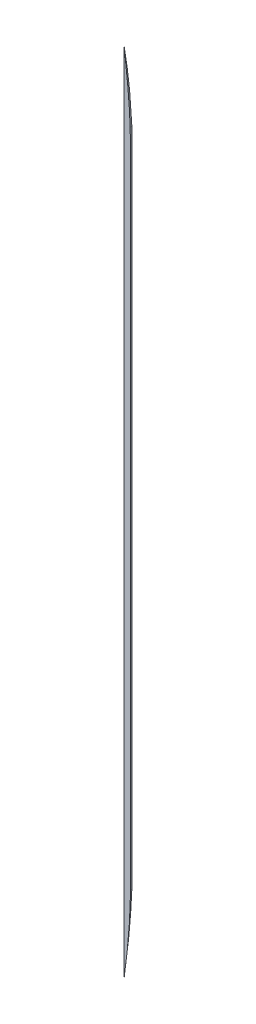
ISO-10303-21;
HEADER;
FILE_DESCRIPTION(('STEP AP214'),'2;1');
FILE_NAME('part.step','',(''),(''),'','','');
FILE_SCHEMA(('AUTOMOTIVE_DESIGN { 1 0 10303 214 1 1 1 1 }'));
ENDSEC;
DATA;
#1=APPLICATION_CONTEXT('core data for automotive mechanical design processes');
#2=APPLICATION_PROTOCOL_DEFINITION('international standard','automotive_design',2000,#1);
#3=PRODUCT_CONTEXT('',#1,'mechanical');
#4=PRODUCT('Part','Part','',(#3));
#5=PRODUCT_RELATED_PRODUCT_CATEGORY('part','',(#4));
#6=PRODUCT_DEFINITION_FORMATION('','',#4);
#7=PRODUCT_DEFINITION_CONTEXT('part definition',#1,'design');
#8=PRODUCT_DEFINITION('design','',#6,#7);
#9=PRODUCT_DEFINITION_SHAPE('','',#8);
#10=(LENGTH_UNIT() NAMED_UNIT(*) SI_UNIT(.MILLI.,.METRE.));
#11=(NAMED_UNIT(*) PLANE_ANGLE_UNIT() SI_UNIT($,.RADIAN.));
#12=(NAMED_UNIT(*) SI_UNIT($,.STERADIAN.) SOLID_ANGLE_UNIT());
#13=UNCERTAINTY_MEASURE_WITH_UNIT(LENGTH_MEASURE(1.E-05),#10,'distance_accuracy_value','');
#14=(GEOMETRIC_REPRESENTATION_CONTEXT(3) GLOBAL_UNCERTAINTY_ASSIGNED_CONTEXT((#13)) GLOBAL_UNIT_ASSIGNED_CONTEXT((#10,
#11,#12)) REPRESENTATION_CONTEXT('',''));
#15=CARTESIAN_POINT('',(0.,0.,0.));
#16=DIRECTION('',(0.,0.,1.));
#17=DIRECTION('',(1.,0.,0.));
#18=AXIS2_PLACEMENT_3D('',#15,#16,#17);
#19=CARTESIAN_POINT('',(12.4612357790928,495.3,-81.6542887644158));
#20=DIRECTION('',(0.169613823099529,0.,-0.985510604211625));
#21=DIRECTION('',(-0.985510604211625,0.,-0.169613823099529));
#22=AXIS2_PLACEMENT_3D('',#19,#20,#21);
#23=PLANE('',#22);
#24=DIRECTION('',(0.,-1.,0.));
#25=VECTOR('',#24,1.);
#26=CARTESIAN_POINT('',(12.4612357790928,495.3,-81.6542887644158));
#27=LINE('',#26,#25);
#28=CARTESIAN_POINT('',(12.4612357790928,415.242456298159,-81.6542887644158));
#29=VERTEX_POINT('',#28);
#30=CARTESIAN_POINT('',(12.4612357790928,80.0575437018381,-81.6542887644158));
#31=VERTEX_POINT('',#30);
#32=EDGE_CURVE('E112',#29,#31,#27,.T.);
#33=ORIENTED_EDGE('',*,*,#32,.T.);
#34=CARTESIAN_POINT('',(15.5576558850124,110.49,-81.1213714626203));
#35=CARTESIAN_POINT('',(15.5573761043063,110.040982554189,-81.1214462577349));
#36=CARTESIAN_POINT('',(15.5517424887391,109.592022848468,-81.1224973708107));
#37=CARTESIAN_POINT('',(15.5308488221356,108.641129884217,-81.126311379444));
#38=CARTESIAN_POINT('',(15.5145277652385,108.139219683667,-81.1292622521924));
#39=CARTESIAN_POINT('',(15.4723158333111,107.082237141519,-81.1367839044593));
#40=CARTESIAN_POINT('',(15.4455902638681,106.527201353635,-81.1414938364033));
#41=CARTESIAN_POINT('',(15.3821952597116,105.363691918705,-81.1525865340898));
#42=CARTESIAN_POINT('',(15.3448125768299,104.755258888441,-81.1590872735439));
#43=CARTESIAN_POINT('',(15.2120828658352,102.767497200931,-81.1820414089014));
#44=CARTESIAN_POINT('',(15.1033493956765,101.389084831941,-81.2006613852127));
#45=CARTESIAN_POINT('',(14.915000144622,99.2407343200765,-81.2327071583013));
#46=CARTESIAN_POINT('',(14.8436336656836,98.4700215676278,-81.2448118374642));
#47=CARTESIAN_POINT('',(14.7291850823923,97.293672104699,-81.2642291324648));
#48=CARTESIAN_POINT('',(14.6886904743312,96.88777830199,-81.2711003530379));
#49=CARTESIAN_POINT('',(14.6041344643552,96.0622610433507,-81.2855434824527));
#50=CARTESIAN_POINT('',(14.5599982870824,95.64264555765,-81.2931313630692));
#51=CARTESIAN_POINT('',(14.4454723448685,94.5729572750733,-81.3127006640724));
#52=CARTESIAN_POINT('',(14.3739882677591,93.9230041057644,-81.3248042670422));
#53=CARTESIAN_POINT('',(14.2282662819478,92.6278937152916,-81.3489076429986));
#54=CARTESIAN_POINT('',(14.1540504678847,91.9827340042198,-81.3609075613251));
#55=CARTESIAN_POINT('',(13.926747515909,90.0614672963077,-81.3971233936048));
#56=CARTESIAN_POINT('',(13.7675838443972,88.786077164369,-81.4217963629207));
#57=CARTESIAN_POINT('',(13.4302987028644,86.2565734188125,-81.4750844917229));
#58=CARTESIAN_POINT('',(13.2524838616839,85.0024183042082,-81.503637642509));
#59=CARTESIAN_POINT('',(12.8746722062458,82.5171949665425,-81.5703998435575));
#60=CARTESIAN_POINT('',(12.6750524995211,81.2860649627977,-81.6084559624795));
#61=CARTESIAN_POINT('',(12.4612357790928,80.0575437018381,-81.6542887644158));
#62=B_SPLINE_CURVE_WITH_KNOTS('',3,(#34,#35,#36,#37,#38,#39,#40,#41,#42,#43,#44,#45,#46,#47,#48,
#49,#50,#51,#52,#53,#54,#55,#56,#57,#58,#59,#60,#61),.UNSPECIFIED.,.F.,.F.,(4,2,2,2,2,2,2,2,2,2,
2,2,2,4),(0.,1.34694051996569,2.85339308380905,4.52043772306062,6.34923968809894,
10.4973384216574,12.8196329498258,14.043526300628,15.3095174275991,17.2714609577166,
19.2200300254349,23.0764538670335,26.8772416352339,30.6204146412588),.UNSPECIFIED.);
#63=CARTESIAN_POINT('',(15.5538067508728,110.49,-81.1220714804129));
#64=VERTEX_POINT('',#63);
#65=EDGE_CURVE('E12',#31,#64,#62,.F.);
#66=ORIENTED_EDGE('',*,*,#65,.T.);
#67=DIRECTION('',(0.,-1.,0.));
#68=VECTOR('',#67,1.);
#69=CARTESIAN_POINT('',(15.553799764757,495.3,-81.1220351300593));
#70=LINE('',#69,#68);
#71=CARTESIAN_POINT('',(15.5557278248849,384.81,-81.1217032963398));
#72=VERTEX_POINT('',#71);
#73=EDGE_CURVE('E98',#72,#64,#70,.T.);
#74=ORIENTED_EDGE('',*,*,#73,.F.);
#75=CARTESIAN_POINT('',(12.4612357790928,415.242456298159,-81.6542887644158));
#76=CARTESIAN_POINT('',(12.5707845457755,414.583787863773,-81.6354495289086));
#77=CARTESIAN_POINT('',(12.676856572538,413.924519584688,-81.6177512070676));
#78=CARTESIAN_POINT('',(12.8813684076054,412.613325228314,-81.5841811918067));
#79=CARTESIAN_POINT('',(12.9798879789422,411.961412128523,-81.5682891708816));
#80=CARTESIAN_POINT('',(13.263366560328,410.029862039112,-81.5226058969181));
#81=CARTESIAN_POINT('',(13.4404101353655,408.74903079735,-81.4941339096765));
#82=CARTESIAN_POINT('',(13.692261574195,406.839061043405,-81.4519710276151));
#83=CARTESIAN_POINT('',(13.7731596921835,406.210711172509,-81.4381475078417));
#84=CARTESIAN_POINT('',(13.9307058477163,404.962203363779,-81.4105936136085));
#85=CARTESIAN_POINT('',(14.0073968612052,404.34205083785,-81.3968645482962));
#86=CARTESIAN_POINT('',(14.1573646030907,403.110051732632,-81.3693842117617));
#87=CARTESIAN_POINT('',(14.2306739021578,402.498209033148,-81.3556358797275));
#88=CARTESIAN_POINT('',(14.3388988544487,401.583500136649,-81.3350137801863));
#89=CARTESIAN_POINT('',(14.3744986124304,401.280713843543,-81.3281762925493));
#90=CARTESIAN_POINT('',(14.445277662291,400.677260234397,-81.3144381175131));
#91=CARTESIAN_POINT('',(14.4804581486358,400.376593039952,-81.3075382163395));
#92=CARTESIAN_POINT('',(14.5597468809453,399.690086096104,-81.2921276486768));
#93=CARTESIAN_POINT('',(14.6035657117567,399.304210276185,-81.2837134077892));
#94=CARTESIAN_POINT('',(14.6876285778722,398.541607746947,-81.2679755670208));
#95=CARTESIAN_POINT('',(14.7279338541541,398.164888238543,-81.2606303157275));
#96=CARTESIAN_POINT('',(14.8426166418515,397.062521963924,-81.2400854798901));
#97=CARTESIAN_POINT('',(14.9140132880755,396.336546784072,-81.2277576105942));
#98=CARTESIAN_POINT('',(15.0445148351463,394.920977022657,-81.2057235649771));
#99=CARTESIAN_POINT('',(15.1040621994699,394.231425055058,-81.1959153960841));
#100=CARTESIAN_POINT('',(15.2114277774684,392.888463377055,-81.1784155883835));
#101=CARTESIAN_POINT('',(15.2597026416506,392.235090784822,-81.1706388722077));
#102=CARTESIAN_POINT('',(15.3839579928387,390.383052778278,-81.1505909161078));
#103=CARTESIAN_POINT('',(15.4495115974416,389.183611704623,-81.1399732428651));
#104=CARTESIAN_POINT('',(15.5148458092607,387.437045657757,-81.128971844842));
#105=CARTESIAN_POINT('',(15.5310027149631,386.890548274515,-81.1261640790714));
#106=CARTESIAN_POINT('',(15.5520345759141,385.832706392485,-81.12244212134));
#107=CARTESIAN_POINT('',(15.5575718034045,385.321375051211,-81.1214171746563));
#108=CARTESIAN_POINT('',(15.5576558850129,384.81,-81.1213714626202));
#109=B_SPLINE_CURVE_WITH_KNOTS('',3,(#75,#76,#77,#78,#79,#80,#81,#82,#83,#84,#85,#86,#87,#88,
#89,#90,#91,#92,#93,#94,#95,#96,#97,#98,#99,#100,#101,#102,#103,#104,#105,#106,#107,#108),
.UNSPECIFIED.,.F.,.F.,(4,2,2,2,2,2,2,2,2,2,2,2,2,2,2,2,4),(0.,2.00391887526714,3.98241142511821,
7.86221306418587,9.76327007914349,11.638344599241,13.4874582251879,14.4023037908844,
15.3106949559744,16.4760285372715,17.6128434637651,19.8015344225848,21.8780376822119,
23.8436105090407,27.4468137491308,29.086954176872,30.6209838878507),.UNSPECIFIED.);
#110=EDGE_CURVE('E89',#72,#29,#109,.F.);
#111=ORIENTED_EDGE('',*,*,#110,.T.);
#112=EDGE_LOOP('',(#33,#66,#74,#111));
#113=FACE_BOUND('',#112,.T.);
#114=ADVANCED_FACE('F47',(#113),#23,.F.);
#115=CARTESIAN_POINT('',(16.2712357790928,495.3,-84.8638776662084));
#116=DIRECTION('',(0.,-1.,0.));
#117=DIRECTION('',(0.,0.,-1.));
#118=AXIS2_PLACEMENT_3D('',#115,#116,#117);
#119=CYLINDRICAL_SURFACE('',#118,3.81);
#120=ORIENTED_EDGE('',*,*,#73,.T.);
#121=CARTESIAN_POINT('',(12.4703197830823,110.49,-85.1268179470178));
#122=CARTESIAN_POINT('',(12.4370250105411,110.49,-84.6455275447029));
#123=CARTESIAN_POINT('',(12.5554900407482,110.49,-83.6703420766679));
#124=CARTESIAN_POINT('',(13.26294750823,110.49,-82.3775827793383));
#125=CARTESIAN_POINT('',(14.3993638497793,110.49,-81.4393500964397));
#126=CARTESIAN_POINT('',(15.3347967598842,110.49,-81.1393735440132));
#127=CARTESIAN_POINT('',(15.8137468300631,110.49,-81.0814440763729));
#128=B_SPLINE_CURVE_WITH_KNOTS('',3,(#121,#122,#123,#124,#125,#126,#127),.UNSPECIFIED.,.F.,.F.,
(4,1,1,1,4),(4.64332088265171,5.02319542018311,5.40306995771452,5.78294449524592,
6.16281903277733),.UNSPECIFIED.);
#129=CARTESIAN_POINT('',(12.4612357790928,110.49,-84.8638776662084));
#130=VERTEX_POINT('',#129);
#131=EDGE_CURVE('E108',#64,#130,#128,.F.);
#132=ORIENTED_EDGE('',*,*,#131,.T.);
#133=DIRECTION('',(0.,-1.,0.));
#134=VECTOR('',#133,1.);
#135=CARTESIAN_POINT('',(12.4612357790928,495.3,-84.8638776662084));
#136=LINE('',#135,#134);
#137=CARTESIAN_POINT('',(12.4612727946764,384.81,-84.8638776824531));
#138=VERTEX_POINT('',#137);
#139=EDGE_CURVE('E107',#138,#130,#136,.T.);
#140=ORIENTED_EDGE('',*,*,#139,.F.);
#141=CARTESIAN_POINT('',(15.8137468300631,384.81,-81.0814440763729));
#142=CARTESIAN_POINT('',(15.3347967598842,384.81,-81.1393735440132));
#143=CARTESIAN_POINT('',(14.3993638497793,384.81,-81.4393500964397));
#144=CARTESIAN_POINT('',(13.26294750823,384.81,-82.3775827793383));
#145=CARTESIAN_POINT('',(12.5554900407482,384.81,-83.6703420766679));
#146=CARTESIAN_POINT('',(12.4370250105411,384.81,-84.6455275447029));
#147=CARTESIAN_POINT('',(12.4703197830823,384.81,-85.1268179470178));
#148=B_SPLINE_CURVE_WITH_KNOTS('',3,(#141,#142,#143,#144,#145,#146,#147),.UNSPECIFIED.,.F.,.F.,
(4,1,1,1,4),(4.64332088265171,5.02319542018311,5.40306995771452,5.78294449524593,
6.16281903277733),.UNSPECIFIED.);
#149=EDGE_CURVE('E93',#138,#72,#148,.F.);
#150=ORIENTED_EDGE('',*,*,#149,.T.);
#151=EDGE_LOOP('',(#120,#132,#140,#150));
#152=FACE_BOUND('',#151,.T.);
#153=ADVANCED_FACE('F104',(#152),#119,.F.);
#154=CARTESIAN_POINT('',(12.4612357790928,495.3,-81.6542887644158));
#155=DIRECTION('',(1.,0.,0.));
#156=DIRECTION('',(0.,0.,-1.));
#157=AXIS2_PLACEMENT_3D('',#154,#155,#156);
#158=PLANE('',#157);
#159=ORIENTED_EDGE('',*,*,#139,.T.);
#160=CARTESIAN_POINT('',(12.4612357790928,80.0575437018382,-81.6542887644158));
#161=CARTESIAN_POINT('',(12.4612064743465,80.3596272559305,-81.7052928197138));
#162=CARTESIAN_POINT('',(12.4610843219237,80.6617948061603,-81.7557986206775));
#163=CARTESIAN_POINT('',(12.4607399860004,81.3133773683714,-81.8634905635664));
#164=CARTESIAN_POINT('',(12.4605051880453,81.6628228401753,-81.9204923176272));
#165=CARTESIAN_POINT('',(12.459825756711,82.8523175462445,-82.1116857069323));
#166=CARTESIAN_POINT('',(12.4595487535186,83.6929949521999,-82.2419994628475));
#167=CARTESIAN_POINT('',(12.4594431394188,85.0251943230358,-82.4410854344774));
#168=CARTESIAN_POINT('',(12.4594758026474,85.5162684593588,-82.5128789450007));
#169=CARTESIAN_POINT('',(12.4595040829288,86.5453496581969,-82.6603769508278));
#170=CARTESIAN_POINT('',(12.4594958975775,87.0833959876438,-82.7358076957878));
#171=CARTESIAN_POINT('',(12.4597132643994,88.6370438531068,-82.9483240873424));
#172=CARTESIAN_POINT('',(12.4601523939581,89.6532791365911,-83.0808055984527));
#173=CARTESIAN_POINT('',(12.4611202079014,91.5132680056769,-83.3119964812341));
#174=CARTESIAN_POINT('',(12.4616207197143,92.3567869972862,-83.4126061248045));
#175=CARTESIAN_POINT('',(12.4625356627591,93.8718411793491,-83.5859843220073));
#176=CARTESIAN_POINT('',(12.4629467218343,94.543206538894,-83.6602339039236));
#177=CARTESIAN_POINT('',(12.4642003350984,96.1159604639281,-83.8265927475506));
#178=CARTESIAN_POINT('',(12.4651422963522,97.0176207907982,-83.9161440896141));
#179=CARTESIAN_POINT('',(12.466512560098,98.799337253664,-84.0830550459346));
#180=CARTESIAN_POINT('',(12.4669531092525,99.679370262574,-84.1606633832438));
#181=CARTESIAN_POINT('',(12.4671868720394,101.418058698445,-84.3049130132944));
#182=CARTESIAN_POINT('',(12.4669960823561,102.276695319286,-84.3717809800309));
#183=CARTESIAN_POINT('',(12.4661083577573,103.972928947973,-84.4954730779497));
#184=CARTESIAN_POINT('',(12.4654243050132,104.810510620103,-84.552507929553));
#185=CARTESIAN_POINT('',(12.4639098036858,106.465086872817,-84.657055336794));
#186=CARTESIAN_POINT('',(12.4630834770562,107.282068544167,-84.7047715752438));
#187=CARTESIAN_POINT('',(12.4618095960485,108.895979421554,-84.7908609097735));
#188=CARTESIAN_POINT('',(12.4613530632808,109.692897746907,-84.8294382880889));
#189=CARTESIAN_POINT('',(12.4613098102458,110.49,-84.8638777311867));
#190=B_SPLINE_CURVE_WITH_KNOTS('',3,(#160,#161,#162,#163,#164,#165,#166,#167,#168,#169,#170,
#171,#172,#173,#174,#175,#176,#177,#178,#179,#180,#181,#182,#183,#184,#185,#186,#187,#188,#189),
.UNSPECIFIED.,.F.,.F.,(4,2,2,2,2,2,2,2,2,2,2,2,2,2,4),(0.,0.919076405326677,1.98126627089971,
4.53335569075159,6.02223196443669,7.65214630309396,10.7265617826436,13.2750200131293,
15.301372495433,18.0195915337247,20.6698905226439,23.2535563112527,25.7720829023215,
28.2271652141505,30.6206846435688),.UNSPECIFIED.);
#191=EDGE_CURVE('E61',#130,#31,#190,.F.);
#192=ORIENTED_EDGE('',*,*,#191,.T.);
#193=ORIENTED_EDGE('',*,*,#32,.F.);
#194=CARTESIAN_POINT('',(12.4613098102458,384.81,-84.8638777311867));
#195=CARTESIAN_POINT('',(12.4613530793774,385.607148359292,-84.8294363227276));
#196=CARTESIAN_POINT('',(12.4618096519219,386.404112798824,-84.7908570378715));
#197=CARTESIAN_POINT('',(12.4630835402614,388.018097528195,-84.7047644976482));
#198=CARTESIAN_POINT('',(12.4639098242887,388.8351069474,-84.6570471474224));
#199=CARTESIAN_POINT('',(12.4654240670888,390.489720309249,-84.5524981072036));
#200=CARTESIAN_POINT('',(12.4661079036843,391.327311353689,-84.495462905677));
#201=CARTESIAN_POINT('',(12.4669951423028,393.023545244382,-84.3717706103973));
#202=CARTESIAN_POINT('',(12.4671856724061,393.882172766649,-84.3049029581723));
#203=CARTESIAN_POINT('',(12.4669514609465,395.620824431562,-84.16065489524));
#204=CARTESIAN_POINT('',(12.4665107380111,396.50082978256,-84.0830479850831));
#205=CARTESIAN_POINT('',(12.4651410175138,398.282472058159,-83.9161396017347));
#206=CARTESIAN_POINT('',(12.4641998057324,399.184085868674,-83.8265895547932));
#207=CARTESIAN_POINT('',(12.4629469757518,400.756935567822,-83.6602175988474));
#208=CARTESIAN_POINT('',(12.4625361136246,401.42844295739,-83.5859510837911));
#209=CARTESIAN_POINT('',(12.4616212082193,402.943639305424,-83.4125539891046));
#210=CARTESIAN_POINT('',(12.4611204007599,403.787158594881,-83.3119438049037));
#211=CARTESIAN_POINT('',(12.4601522982079,405.64700526272,-83.0807685519141));
#212=CARTESIAN_POINT('',(12.4597132100883,406.663098232202,-82.9483047264123));
#213=CARTESIAN_POINT('',(12.4594959168996,408.216596475673,-82.7358086873291));
#214=CARTESIAN_POINT('',(12.4595041462213,408.754635270272,-82.6603789514519));
#215=CARTESIAN_POINT('',(12.4594759217503,409.783704415821,-82.5128826842412));
#216=CARTESIAN_POINT('',(12.4594432726242,410.274774030024,-82.4410898776551));
#217=CARTESIAN_POINT('',(12.4595488989801,411.606968879432,-82.2420047768557));
#218=CARTESIAN_POINT('',(12.4598258851735,412.447646286336,-82.1116911865272));
#219=CARTESIAN_POINT('',(12.4605052522681,413.637145524673,-81.9204973508497));
#220=CARTESIAN_POINT('',(12.4607400288471,413.98659551898,-81.8634949370092));
#221=CARTESIAN_POINT('',(12.461084335485,414.638190136638,-81.7558011137104));
#222=CARTESIAN_POINT('',(12.4612064779283,414.94036521872,-81.7052940856866));
#223=CARTESIAN_POINT('',(12.4612357790928,415.242456298159,-81.6542887644158));
#224=B_SPLINE_CURVE_WITH_KNOTS('',3,(#194,#195,#196,#197,#198,#199,#200,#201,#202,#203,#204,
#205,#206,#207,#208,#209,#210,#211,#212,#213,#214,#215,#216,#217,#218,#219,#220,#221,#222,#223),
.UNSPECIFIED.,.F.,.F.,(4,2,2,2,2,2,2,2,2,2,2,2,2,2,4),(0.,2.3936578820473,4.84882349071344,
7.3673781975325,9.95101669766004,12.6012326358086,15.3193124328368,17.346094008502,
19.8945533207083,22.9685386061599,24.5984301397323,26.0872926846593,28.6393820322945,
29.7015856068583,30.6206849052901),.UNSPECIFIED.);
#225=EDGE_CURVE('E95',#29,#138,#224,.F.);
#226=ORIENTED_EDGE('',*,*,#225,.T.);
#227=EDGE_LOOP('',(#159,#192,#193,#226));
#228=FACE_BOUND('',#227,.T.);
#229=ADVANCED_FACE('F129',(#228),#158,.F.);
#230=CARTESIAN_POINT('',(12.4703197830823,384.81,-85.1268179470178));
#231=CARTESIAN_POINT('',(12.4370250105411,384.81,-84.6455275447029));
#232=CARTESIAN_POINT('',(12.5554900407482,384.81,-83.6703420766679));
#233=CARTESIAN_POINT('',(13.26294750823,384.81,-82.3775827793383));
#234=CARTESIAN_POINT('',(14.3993638497793,384.81,-81.4393500964397));
#235=CARTESIAN_POINT('',(15.3347967598842,384.81,-81.1393735440132));
#236=CARTESIAN_POINT('',(15.8137468300631,384.81,-81.0814440763729));
#237=CARTESIAN_POINT('',(12.4703197830824,403.394202713986,-85.1268179470178));
#238=CARTESIAN_POINT('',(12.4370250103244,403.394202712767,-84.6455275447179));
#239=CARTESIAN_POINT('',(12.5554900408491,403.394202714508,-83.6703420766633));
#240=CARTESIAN_POINT('',(13.2629475082019,403.394202713986,-82.3775827793322));
#241=CARTESIAN_POINT('',(14.3993638497906,403.394202713464,-81.4393500964691));
#242=CARTESIAN_POINT('',(15.3347967598764,403.394202715204,-81.1393735439489));
#243=CARTESIAN_POINT('',(15.8137468300631,403.394202713986,-81.0814440763729));
#244=CARTESIAN_POINT('',(12.4703197830824,421.978405427971,-85.1268179470178));
#245=CARTESIAN_POINT('',(12.4370250101467,421.978405425534,-84.6455275447179));
#246=CARTESIAN_POINT('',(12.5554900409343,421.978405429016,-83.6703420766741));
#247=CARTESIAN_POINT('',(13.2629475081702,421.978405427971,-82.3775827792941));
#248=CARTESIAN_POINT('',(14.3993638498324,421.978405426927,-81.4393500966105));
#249=CARTESIAN_POINT('',(15.3347967598003,421.978405430408,-81.1393735436443));
#250=CARTESIAN_POINT('',(15.8137468300631,421.978405427971,-81.0814440763729));
#251=CARTESIAN_POINT('',(4.47713414631887,462.938228253301,-85.6797716239995));
#252=CARTESIAN_POINT('',(4.37382169922449,462.93822825452,-84.1863453229457));
#253=CARTESIAN_POINT('',(4.74141430320678,462.93822825275,-81.1603809139785));
#254=CARTESIAN_POINT('',(6.93662863577681,462.938228253403,-77.1489966702307));
#255=CARTESIAN_POINT('',(10.4628864757372,462.938228253447,-74.2376953873616));
#256=CARTESIAN_POINT('',(13.3655001675713,462.938228252895,-73.3068792481172));
#257=CARTESIAN_POINT('',(14.8516645056445,462.938228253302,-73.127126255611));
#258=CARTESIAN_POINT('',(-20.1853808185745,487.378759777311,-87.3858784196093));
#259=CARTESIAN_POINT('',(-20.504728776146,487.37875977853,-82.7695649626959));
#260=CARTESIAN_POINT('',(-19.3684673603552,487.378759776789,-73.4160399783466));
#261=CARTESIAN_POINT('',(-12.5828647119016,487.378759777311,-61.016494684552));
#262=CARTESIAN_POINT('',(-1.68288825773542,487.378759777833,-52.0174036131486));
#263=CARTESIAN_POINT('',(7.28934869500578,487.378759776093,-49.1401681869732));
#264=CARTESIAN_POINT('',(11.8832147783788,487.378759777311,-48.5845357035051));
#265=CARTESIAN_POINT('',(-61.5172251115978,495.3,-90.2451383338474));
#266=CARTESIAN_POINT('',(-62.1986264140607,495.3,-80.3951864655935));
#267=CARTESIAN_POINT('',(-59.7741549506325,495.3,-60.437319269204));
#268=CARTESIAN_POINT('',(-45.2955325346387,495.3,-33.9800768218315));
#269=CARTESIAN_POINT('',(-22.0379603506093,495.3,-14.7784747762526));
#270=CARTESIAN_POINT('',(-2.89365765799156,495.3,-8.63924035517318));
#271=CARTESIAN_POINT('',(6.90839764826607,495.3,-7.45367242005551));
#272=CARTESIAN_POINT('',(-80.2702206057438,495.3,-91.5424355923041));
#273=CARTESIAN_POINT('',(-81.1158919738206,495.3,-79.3178885601491));
#274=CARTESIAN_POINT('',(-78.1069366173099,495.3,-54.5486420246034));
#275=CARTESIAN_POINT('',(-60.1378538193035,495.3,-21.7131714602912));
#276=CARTESIAN_POINT('',(-31.2734198799184,495.3,2.11749192039176));
#277=CARTESIAN_POINT('',(-7.51386939836865,495.3,9.73675350927463));
#278=CARTESIAN_POINT('',(4.65123432006317,495.3,11.2081344027063));
#279=CARTESIAN_POINT('',(-99.0232160998899,495.3,-92.8397328507608));
#280=CARTESIAN_POINT('',(-100.033157533276,495.3,-78.2405906547046));
#281=CARTESIAN_POINT('',(-96.439718284129,495.3,-48.6599647800031));
#282=CARTESIAN_POINT('',(-74.9801751039293,495.3,-9.44626609874925));
#283=CARTESIAN_POINT('',(-40.5088794092413,495.3,19.0134586170303));
#284=CARTESIAN_POINT('',(-12.1340811387394,495.3,28.1127473737351));
#285=CARTESIAN_POINT('',(2.39407099186028,495.3,29.869941225468));
#286=B_SPLINE_SURFACE_WITH_KNOTS('',5,3,((#230,#231,#232,#233,#234,#235,#236),(#237,#238,#239,
#240,#241,#242,#243),(#244,#245,#246,#247,#248,#249,#250),(#251,#252,#253,#254,#255,#256,#257),
(#258,#259,#260,#261,#262,#263,#264),(#265,#266,#267,#268,#269,#270,#271),(#272,#273,#274,#275,
#276,#277,#278),(#279,#280,#281,#282,#283,#284,#285)),.UNSPECIFIED.,.F.,.F.,.F.,(6,2,6),(4,1,1,
1,4),(0.,0.5,1.),(4.64332088265171,5.02319542018311,5.40306995771452,5.78294449524592,
6.16281903277733),.UNSPECIFIED.);
#287=ORIENTED_EDGE('',*,*,#110,.F.);
#288=ORIENTED_EDGE('',*,*,#149,.F.);
#289=ORIENTED_EDGE('',*,*,#225,.F.);
#290=EDGE_LOOP('',(#287,#288,#289));
#291=FACE_BOUND('',#290,.T.);
#292=ADVANCED_FACE('F92',(#291),#286,.T.);
#293=CARTESIAN_POINT('',(-99.0232160998899,0.,-92.8397328507608));
#294=CARTESIAN_POINT('',(-100.033157533276,0.,-78.2405906547046));
#295=CARTESIAN_POINT('',(-96.439718284129,0.,-48.6599647800031));
#296=CARTESIAN_POINT('',(-74.9801751039293,0.,-9.44626609874925));
#297=CARTESIAN_POINT('',(-40.5088794092413,0.,19.0134586170303));
#298=CARTESIAN_POINT('',(-12.1340811387394,0.,28.1127473737351));
#299=CARTESIAN_POINT('',(2.39407099186028,0.,29.869941225468));
#300=CARTESIAN_POINT('',(-80.2702206057438,0.,-91.5424355923041));
#301=CARTESIAN_POINT('',(-81.1158919746329,-3.59035824102211E-12,-79.3178885601491));
#302=CARTESIAN_POINT('',(-78.1069366169316,1.65158734683018E-12,-54.5486420246133));
#303=CARTESIAN_POINT('',(-60.137853819409,-4.78285079219368E-13,-21.7131714602562));
#304=CARTESIAN_POINT('',(-31.2734198798746,0.,2.11749192026211));
#305=CARTESIAN_POINT('',(-7.51386939840038,0.,9.73675350955386));
#306=CARTESIAN_POINT('',(4.65123432006318,0.,11.2081344027063));
#307=CARTESIAN_POINT('',(-61.5172251115977,0.,-90.2451383338474));
#308=CARTESIAN_POINT('',(-62.1986264156346,-1.1201995308698E-11,-80.3951864655935));
#309=CARTESIAN_POINT('',(-59.7741549499,9.54700101483282E-12,-60.4373192692201));
#310=CARTESIAN_POINT('',(-45.2955325348419,-1.66822873066877E-11,-33.9800768217751));
#311=CARTESIAN_POINT('',(-22.0379603505295,5.6953164713089E-11,-14.7784747764619));
#312=CARTESIAN_POINT('',(-2.89365765804233,-1.21867725086185E-10,-8.6392403547226));
#313=CARTESIAN_POINT('',(6.90839764826607,0.,-7.45367242005553));
#314=CARTESIAN_POINT('',(-20.1853808185746,7.92124022268883,-87.3858784196093));
#315=CARTESIAN_POINT('',(-20.5047287747752,7.92124022266345,-82.7695649627975));
#316=CARTESIAN_POINT('',(-19.3684673609904,7.92124022269335,-73.4160399783121));
#317=CARTESIAN_POINT('',(-12.582864711735,7.92124022271101,-61.0164946845203));
#318=CARTESIAN_POINT('',(-1.68288825776676,7.92124022259542,-52.0174036133099));
#319=CARTESIAN_POINT('',(7.2893486949677,7.9212402228919,-49.1401681866177));
#320=CARTESIAN_POINT('',(11.8832147783788,7.92124022268881,-48.5845357035051));
#321=CARTESIAN_POINT('',(4.47713414631879,32.3617717466983,-85.6797716239995));
#322=CARTESIAN_POINT('',(4.37382169968136,32.3617717474091,-84.1863453228441));
#323=CARTESIAN_POINT('',(4.74141430299553,32.3617717463701,-81.1603809139567));
#324=CARTESIAN_POINT('',(6.93662863583073,32.3617717467809,-77.1489966704592));
#325=CARTESIAN_POINT('',(10.4628864757326,32.3617717466965,-74.2376953864695));
#326=CARTESIAN_POINT('',(13.3655001675459,32.3617717466476,-73.3068792500464));
#327=CARTESIAN_POINT('',(14.8516645056444,32.3617717466983,-73.1271262556109));
#328=CARTESIAN_POINT('',(12.4703197830823,73.3215945720285,-85.1268179470178));
#329=CARTESIAN_POINT('',(12.4370250101594,73.3215945722316,-84.6455275447179));
#330=CARTESIAN_POINT('',(12.5554900409257,73.3215945719378,-83.6703420766633));
#331=CARTESIAN_POINT('',(13.2629475081813,73.3215945720413,-82.3775827793322));
#332=CARTESIAN_POINT('',(14.3993638497965,73.3215945720683,-81.439350096469));
#333=CARTESIAN_POINT('',(15.3347967598764,73.321594571927,-81.1393735439488));
#334=CARTESIAN_POINT('',(15.8137468300631,73.3215945720285,-81.0814440763729));
#335=CARTESIAN_POINT('',(12.4703197830823,91.9057972860142,-85.1268179470178));
#336=CARTESIAN_POINT('',(12.4370250103244,91.9057972863189,-84.6455275447179));
#337=CARTESIAN_POINT('',(12.5554900408491,91.9057972858765,-83.6703420766633));
#338=CARTESIAN_POINT('',(13.2629475082019,91.9057972860397,-82.3775827793322));
#339=CARTESIAN_POINT('',(14.3993638497906,91.9057972860505,-81.439350096469));
#340=CARTESIAN_POINT('',(15.3347967598764,91.9057972859127,-81.1393735439488));
#341=CARTESIAN_POINT('',(15.8137468300631,91.9057972860142,-81.0814440763729));
#342=CARTESIAN_POINT('',(12.4703197830823,110.49,-85.1268179470178));
#343=CARTESIAN_POINT('',(12.4370250105411,110.49,-84.6455275447029));
#344=CARTESIAN_POINT('',(12.5554900407482,110.49,-83.6703420766679));
#345=CARTESIAN_POINT('',(13.26294750823,110.49,-82.3775827793383));
#346=CARTESIAN_POINT('',(14.3993638497793,110.49,-81.4393500964397));
#347=CARTESIAN_POINT('',(15.3347967598842,110.49,-81.1393735440132));
#348=CARTESIAN_POINT('',(15.8137468300631,110.49,-81.0814440763729));
#349=B_SPLINE_SURFACE_WITH_KNOTS('',5,3,((#293,#294,#295,#296,#297,#298,#299),(#300,#301,#302,
#303,#304,#305,#306),(#307,#308,#309,#310,#311,#312,#313),(#314,#315,#316,#317,#318,#319,#320),
(#321,#322,#323,#324,#325,#326,#327),(#328,#329,#330,#331,#332,#333,#334),(#335,#336,#337,#338,
#339,#340,#341),(#342,#343,#344,#345,#346,#347,#348)),.UNSPECIFIED.,.F.,.F.,.F.,(6,2,6),(4,1,1,
1,4),(0.,0.5,1.),(4.64332088265171,5.02319542018311,5.40306995771452,5.78294449524592,
6.16281903277733),.UNSPECIFIED.);
#350=ORIENTED_EDGE('',*,*,#131,.F.);
#351=ORIENTED_EDGE('',*,*,#65,.F.);
#352=ORIENTED_EDGE('',*,*,#191,.F.);
#353=EDGE_LOOP('',(#350,#351,#352));
#354=FACE_BOUND('',#353,.T.);
#355=ADVANCED_FACE('F50',(#354),#349,.T.);
#356=CLOSED_SHELL('',(#114,#153,#229,#292,#355));
#357=MANIFOLD_SOLID_BREP('B2',#356);
#358=ADVANCED_BREP_SHAPE_REPRESENTATION('',(#18,#357),#14);
#359=SHAPE_DEFINITION_REPRESENTATION(#9,#358);
ENDSEC;
END-ISO-10303-21;
